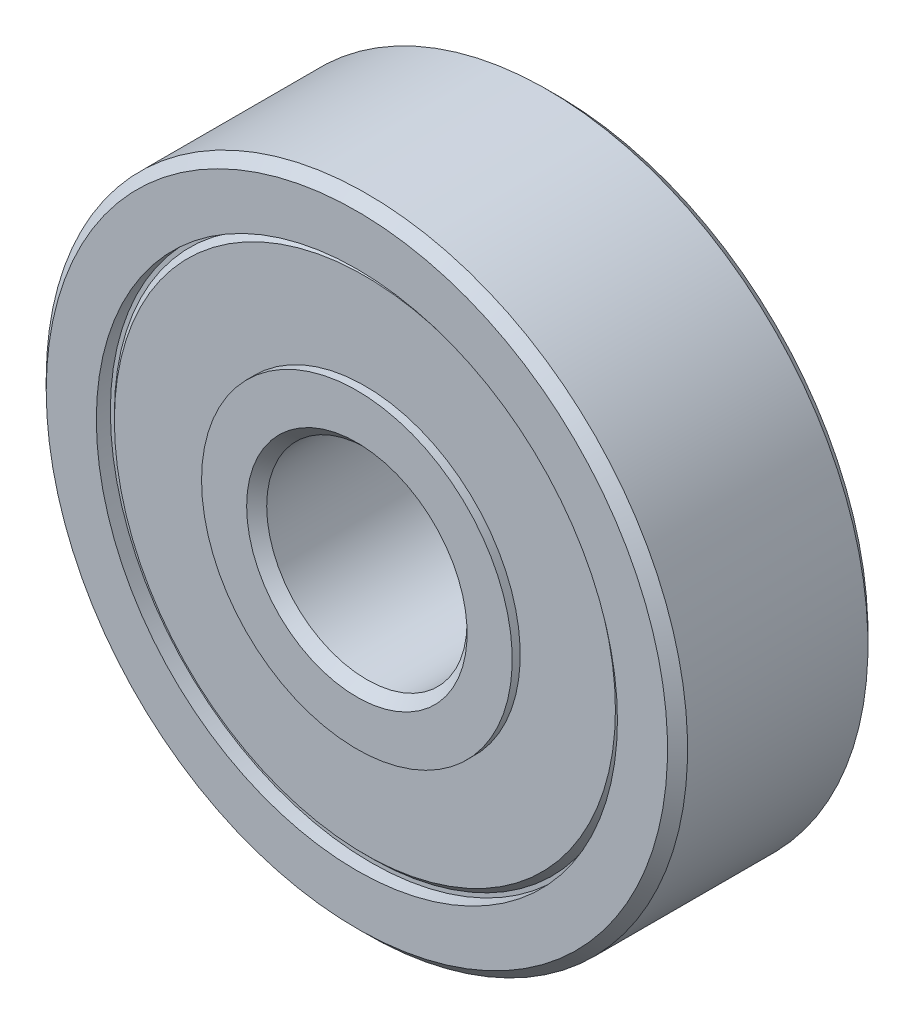
ISO-10303-21;
HEADER;
FILE_DESCRIPTION(('STEP AP214'),'2;1');
FILE_NAME('part.step','',(''),(''),'','','');
FILE_SCHEMA(('AUTOMOTIVE_DESIGN { 1 0 10303 214 1 1 1 1 }'));
ENDSEC;
DATA;
#1=APPLICATION_CONTEXT('core data for automotive mechanical design processes');
#2=APPLICATION_PROTOCOL_DEFINITION('international standard','automotive_design',2000,#1);
#3=PRODUCT_CONTEXT('',#1,'mechanical');
#4=PRODUCT('Part','Part','',(#3));
#5=PRODUCT_RELATED_PRODUCT_CATEGORY('part','',(#4));
#6=PRODUCT_DEFINITION_FORMATION('','',#4);
#7=PRODUCT_DEFINITION_CONTEXT('part definition',#1,'design');
#8=PRODUCT_DEFINITION('design','',#6,#7);
#9=PRODUCT_DEFINITION_SHAPE('','',#8);
#10=(LENGTH_UNIT() NAMED_UNIT(*) SI_UNIT(.MILLI.,.METRE.));
#11=(NAMED_UNIT(*) PLANE_ANGLE_UNIT() SI_UNIT($,.RADIAN.));
#12=(NAMED_UNIT(*) SI_UNIT($,.STERADIAN.) SOLID_ANGLE_UNIT());
#13=UNCERTAINTY_MEASURE_WITH_UNIT(LENGTH_MEASURE(1.E-05),#10,'distance_accuracy_value','');
#14=(GEOMETRIC_REPRESENTATION_CONTEXT(3) GLOBAL_UNCERTAINTY_ASSIGNED_CONTEXT((#13)) GLOBAL_UNIT_ASSIGNED_CONTEXT((#10,
#11,#12)) REPRESENTATION_CONTEXT('',''));
#15=CARTESIAN_POINT('',(0.,0.,0.));
#16=DIRECTION('',(0.,0.,1.));
#17=DIRECTION('',(1.,0.,0.));
#18=AXIS2_PLACEMENT_3D('',#15,#16,#17);
#19=CARTESIAN_POINT('',(0.,0.,-2.49999999999997));
#20=DIRECTION('',(0.,0.,-1.));
#21=DIRECTION('',(-1.,0.,0.));
#22=AXIS2_PLACEMENT_3D('',#19,#20,#21);
#23=CONICAL_SURFACE('',#22,2.74999999999991,0.785398163397768);
#24=CARTESIAN_POINT('',(0.,0.,-2.25000000000019));
#25=DIRECTION('',(0.,0.,-1.));
#26=DIRECTION('',(-1.,0.,0.));
#27=AXIS2_PLACEMENT_3D('',#24,#25,#26);
#28=CIRCLE('',#27,2.49999999999996);
#29=CARTESIAN_POINT('',(-2.49999999999996,0.,-2.25000000000019));
#30=VERTEX_POINT('',#29);
#31=EDGE_CURVE('E118',#30,#30,#28,.T.);
#32=ORIENTED_EDGE('',*,*,#31,.F.);
#33=EDGE_LOOP('',(#32));
#34=FACE_BOUND('',#33,.T.);
#35=CARTESIAN_POINT('',(0.,0.,-2.49999999999997));
#36=DIRECTION('',(0.,0.,-1.));
#37=DIRECTION('',(-1.,0.,0.));
#38=AXIS2_PLACEMENT_3D('',#35,#36,#37);
#39=CIRCLE('',#38,2.74999999999991);
#40=CARTESIAN_POINT('',(-2.74999999999991,0.,-2.49999999999997));
#41=VERTEX_POINT('',#40);
#42=EDGE_CURVE('E10',#41,#41,#39,.T.);
#43=ORIENTED_EDGE('',*,*,#42,.T.);
#44=EDGE_LOOP('',(#43));
#45=FACE_BOUND('',#44,.T.);
#46=ADVANCED_FACE('F34',(#34,#45),#23,.F.);
#47=CARTESIAN_POINT('',(2.74999999999991,0.,-2.49999999999997));
#48=DIRECTION('',(0.,0.,1.));
#49=DIRECTION('',(1.,0.,0.));
#50=AXIS2_PLACEMENT_3D('',#47,#48,#49);
#51=PLANE('',#50);
#52=ORIENTED_EDGE('',*,*,#42,.F.);
#53=EDGE_LOOP('',(#52));
#54=FACE_BOUND('',#53,.T.);
#55=CARTESIAN_POINT('',(0.,0.,-2.49999999999997));
#56=DIRECTION('',(0.,0.,-1.));
#57=DIRECTION('',(-1.,0.,0.));
#58=AXIS2_PLACEMENT_3D('',#55,#56,#57);
#59=CIRCLE('',#58,3.875);
#60=CARTESIAN_POINT('',(-3.875,0.,-2.49999999999997));
#61=VERTEX_POINT('',#60);
#62=EDGE_CURVE('E41',#61,#61,#59,.T.);
#63=ORIENTED_EDGE('',*,*,#62,.T.);
#64=EDGE_LOOP('',(#63));
#65=FACE_BOUND('',#64,.T.);
#66=ADVANCED_FACE('F125',(#54,#65),#51,.F.);
#67=CARTESIAN_POINT('',(0.,0.,-5.34568848414309));
#68=DIRECTION('',(0.,0.,-1.));
#69=DIRECTION('',(-1.,0.,0.));
#70=AXIS2_PLACEMENT_3D('',#67,#68,#69);
#71=CYLINDRICAL_SURFACE('',#70,3.875);
#72=ORIENTED_EDGE('',*,*,#62,.F.);
#73=EDGE_LOOP('',(#72));
#74=FACE_BOUND('',#73,.T.);
#75=CARTESIAN_POINT('',(0.,0.,-2.29999999999982));
#76=DIRECTION('',(0.,0.,-1.));
#77=DIRECTION('',(-1.,0.,0.));
#78=AXIS2_PLACEMENT_3D('',#75,#76,#77);
#79=CIRCLE('',#78,3.875);
#80=CARTESIAN_POINT('',(-3.875,0.,-2.29999999999982));
#81=VERTEX_POINT('',#80);
#82=EDGE_CURVE('E47',#81,#81,#79,.T.);
#83=ORIENTED_EDGE('',*,*,#82,.T.);
#84=EDGE_LOOP('',(#83));
#85=FACE_BOUND('',#84,.T.);
#86=ADVANCED_FACE('F129',(#74,#85),#71,.T.);
#87=CARTESIAN_POINT('',(3.875,0.,-2.29999999999982));
#88=DIRECTION('',(0.,0.,1.));
#89=DIRECTION('',(1.,0.,0.));
#90=AXIS2_PLACEMENT_3D('',#87,#88,#89);
#91=PLANE('',#90);
#92=ORIENTED_EDGE('',*,*,#82,.F.);
#93=EDGE_LOOP('',(#92));
#94=FACE_BOUND('',#93,.T.);
#95=CARTESIAN_POINT('',(0.,0.,-2.29999999999982));
#96=DIRECTION('',(0.,0.,-1.));
#97=DIRECTION('',(-1.,0.,0.));
#98=AXIS2_PLACEMENT_3D('',#95,#96,#97);
#99=CIRCLE('',#98,6.24999999999996);
#100=CARTESIAN_POINT('',(-6.24999999999996,0.,-2.29999999999982));
#101=VERTEX_POINT('',#100);
#102=EDGE_CURVE('E52',#101,#101,#99,.T.);
#103=ORIENTED_EDGE('',*,*,#102,.T.);
#104=EDGE_LOOP('',(#103));
#105=FACE_BOUND('',#104,.T.);
#106=ADVANCED_FACE('F134',(#94,#105),#91,.F.);
#107=CARTESIAN_POINT('',(0.,0.,-2.1500000000001));
#108=DIRECTION('',(0.,0.,1.));
#109=DIRECTION('',(1.,0.,0.));
#110=AXIS2_PLACEMENT_3D('',#107,#108,#109);
#111=CONICAL_SURFACE('',#110,6.3999999999999,0.785398163398171);
#112=ORIENTED_EDGE('',*,*,#102,.F.);
#113=EDGE_LOOP('',(#112));
#114=FACE_BOUND('',#113,.T.);
#115=CARTESIAN_POINT('',(0.,0.,-2.1500000000001));
#116=DIRECTION('',(0.,0.,-1.));
#117=DIRECTION('',(-1.,0.,0.));
#118=AXIS2_PLACEMENT_3D('',#115,#116,#117);
#119=CIRCLE('',#118,6.3999999999999);
#120=CARTESIAN_POINT('',(-6.3999999999999,0.,-2.1500000000001));
#121=VERTEX_POINT('',#120);
#122=EDGE_CURVE('E58',#121,#121,#119,.T.);
#123=ORIENTED_EDGE('',*,*,#122,.T.);
#124=EDGE_LOOP('',(#123));
#125=FACE_BOUND('',#124,.T.);
#126=ADVANCED_FACE('F140',(#114,#125),#111,.T.);
#127=CARTESIAN_POINT('',(6.3999999999999,0.,-2.15000000000005));
#128=DIRECTION('',(0.,0.,1.));
#129=DIRECTION('',(1.,0.,0.));
#130=AXIS2_PLACEMENT_3D('',#127,#128,#129);
#131=PLANE('',#130);
#132=ORIENTED_EDGE('',*,*,#122,.F.);
#133=EDGE_LOOP('',(#132));
#134=FACE_BOUND('',#133,.T.);
#135=CARTESIAN_POINT('',(0.,0.,-2.15));
#136=DIRECTION('',(0.,0.,-1.));
#137=DIRECTION('',(-1.,0.,0.));
#138=AXIS2_PLACEMENT_3D('',#135,#136,#137);
#139=CIRCLE('',#138,6.5);
#140=CARTESIAN_POINT('',(-6.5,0.,-2.15));
#141=VERTEX_POINT('',#140);
#142=EDGE_CURVE('E62',#141,#141,#139,.T.);
#143=ORIENTED_EDGE('',*,*,#142,.T.);
#144=EDGE_LOOP('',(#143));
#145=FACE_BOUND('',#144,.T.);
#146=ADVANCED_FACE('F144',(#134,#145),#131,.F.);
#147=CARTESIAN_POINT('',(0.,0.,-5.34568848414309));
#148=DIRECTION('',(0.,0.,-1.));
#149=DIRECTION('',(-1.,0.,0.));
#150=AXIS2_PLACEMENT_3D('',#147,#148,#149);
#151=CYLINDRICAL_SURFACE('',#150,6.5);
#152=ORIENTED_EDGE('',*,*,#142,.F.);
#153=EDGE_LOOP('',(#152));
#154=FACE_BOUND('',#153,.T.);
#155=CARTESIAN_POINT('',(0.,0.,-2.5));
#156=DIRECTION('',(0.,0.,-1.));
#157=DIRECTION('',(-1.,0.,0.));
#158=AXIS2_PLACEMENT_3D('',#155,#156,#157);
#159=CIRCLE('',#158,6.5);
#160=CARTESIAN_POINT('',(-6.5,0.,-2.5));
#161=VERTEX_POINT('',#160);
#162=EDGE_CURVE('E66',#161,#161,#159,.T.);
#163=ORIENTED_EDGE('',*,*,#162,.T.);
#164=EDGE_LOOP('',(#163));
#165=FACE_BOUND('',#164,.T.);
#166=ADVANCED_FACE('F148',(#154,#165),#151,.F.);
#167=CARTESIAN_POINT('',(6.5,0.,-2.49999999999997));
#168=DIRECTION('',(0.,0.,1.));
#169=DIRECTION('',(1.,0.,0.));
#170=AXIS2_PLACEMENT_3D('',#167,#168,#169);
#171=PLANE('',#170);
#172=ORIENTED_EDGE('',*,*,#162,.F.);
#173=EDGE_LOOP('',(#172));
#174=FACE_BOUND('',#173,.T.);
#175=CARTESIAN_POINT('',(0.,0.,-2.49999999999995));
#176=DIRECTION('',(0.,0.,-1.));
#177=DIRECTION('',(-1.,0.,0.));
#178=AXIS2_PLACEMENT_3D('',#175,#176,#177);
#179=CIRCLE('',#178,7.75000000000005);
#180=CARTESIAN_POINT('',(-7.75000000000005,0.,-2.49999999999995));
#181=VERTEX_POINT('',#180);
#182=EDGE_CURVE('E70',#181,#181,#179,.T.);
#183=ORIENTED_EDGE('',*,*,#182,.T.);
#184=EDGE_LOOP('',(#183));
#185=FACE_BOUND('',#184,.T.);
#186=ADVANCED_FACE('F152',(#174,#185),#171,.F.);
#187=CARTESIAN_POINT('',(0.,0.,-2.25000000000009));
#188=DIRECTION('',(0.,0.,1.));
#189=DIRECTION('',(1.,0.,0.));
#190=AXIS2_PLACEMENT_3D('',#187,#188,#189);
#191=CONICAL_SURFACE('',#190,8.,0.785398163397619);
#192=ORIENTED_EDGE('',*,*,#182,.F.);
#193=EDGE_LOOP('',(#192));
#194=FACE_BOUND('',#193,.T.);
#195=CARTESIAN_POINT('',(0.,0.,-2.25000000000009));
#196=DIRECTION('',(0.,0.,-1.));
#197=DIRECTION('',(-1.,0.,0.));
#198=AXIS2_PLACEMENT_3D('',#195,#196,#197);
#199=CIRCLE('',#198,8.);
#200=CARTESIAN_POINT('',(-8.,0.,-2.25000000000009));
#201=VERTEX_POINT('',#200);
#202=EDGE_CURVE('E74',#201,#201,#199,.T.);
#203=ORIENTED_EDGE('',*,*,#202,.T.);
#204=EDGE_LOOP('',(#203));
#205=FACE_BOUND('',#204,.T.);
#206=ADVANCED_FACE('F156',(#194,#205),#191,.T.);
#207=CARTESIAN_POINT('',(0.,0.,-5.34568848414309));
#208=DIRECTION('',(0.,0.,-1.));
#209=DIRECTION('',(-1.,0.,0.));
#210=AXIS2_PLACEMENT_3D('',#207,#208,#209);
#211=CYLINDRICAL_SURFACE('',#210,8.);
#212=ORIENTED_EDGE('',*,*,#202,.F.);
#213=EDGE_LOOP('',(#212));
#214=FACE_BOUND('',#213,.T.);
#215=CARTESIAN_POINT('',(0.,0.,2.25000000000019));
#216=DIRECTION('',(0.,0.,-1.));
#217=DIRECTION('',(-1.,0.,0.));
#218=AXIS2_PLACEMENT_3D('',#215,#216,#217);
#219=CIRCLE('',#218,8.);
#220=CARTESIAN_POINT('',(-8.,0.,2.25000000000019));
#221=VERTEX_POINT('',#220);
#222=EDGE_CURVE('E78',#221,#221,#219,.T.);
#223=ORIENTED_EDGE('',*,*,#222,.T.);
#224=EDGE_LOOP('',(#223));
#225=FACE_BOUND('',#224,.T.);
#226=ADVANCED_FACE('F160',(#214,#225),#211,.T.);
#227=CARTESIAN_POINT('',(0.,0.,2.49999999999995));
#228=DIRECTION('',(0.,0.,-1.));
#229=DIRECTION('',(-1.,0.,0.));
#230=AXIS2_PLACEMENT_3D('',#227,#228,#229);
#231=CONICAL_SURFACE('',#230,7.75000000000005,0.785398163397823);
#232=ORIENTED_EDGE('',*,*,#222,.F.);
#233=EDGE_LOOP('',(#232));
#234=FACE_BOUND('',#233,.T.);
#235=CARTESIAN_POINT('',(0.,0.,2.49999999999995));
#236=DIRECTION('',(0.,0.,-1.));
#237=DIRECTION('',(-1.,0.,0.));
#238=AXIS2_PLACEMENT_3D('',#235,#236,#237);
#239=CIRCLE('',#238,7.75000000000005);
#240=CARTESIAN_POINT('',(-7.75000000000005,0.,2.49999999999995));
#241=VERTEX_POINT('',#240);
#242=EDGE_CURVE('E82',#241,#241,#239,.T.);
#243=ORIENTED_EDGE('',*,*,#242,.T.);
#244=EDGE_LOOP('',(#243));
#245=FACE_BOUND('',#244,.T.);
#246=ADVANCED_FACE('F164',(#234,#245),#231,.T.);
#247=CARTESIAN_POINT('',(6.5,0.,2.49999999999997));
#248=DIRECTION('',(0.,0.,-1.));
#249=DIRECTION('',(-1.,0.,0.));
#250=AXIS2_PLACEMENT_3D('',#247,#248,#249);
#251=PLANE('',#250);
#252=ORIENTED_EDGE('',*,*,#242,.F.);
#253=EDGE_LOOP('',(#252));
#254=FACE_BOUND('',#253,.T.);
#255=CARTESIAN_POINT('',(0.,0.,2.5));
#256=DIRECTION('',(0.,0.,-1.));
#257=DIRECTION('',(-1.,0.,0.));
#258=AXIS2_PLACEMENT_3D('',#255,#256,#257);
#259=CIRCLE('',#258,6.5);
#260=CARTESIAN_POINT('',(-6.5,0.,2.5));
#261=VERTEX_POINT('',#260);
#262=EDGE_CURVE('E86',#261,#261,#259,.T.);
#263=ORIENTED_EDGE('',*,*,#262,.T.);
#264=EDGE_LOOP('',(#263));
#265=FACE_BOUND('',#264,.T.);
#266=ADVANCED_FACE('F168',(#254,#265),#251,.F.);
#267=CARTESIAN_POINT('',(0.,0.,-5.34568848414309));
#268=DIRECTION('',(0.,0.,-1.));
#269=DIRECTION('',(-1.,0.,0.));
#270=AXIS2_PLACEMENT_3D('',#267,#268,#269);
#271=CYLINDRICAL_SURFACE('',#270,6.5);
#272=ORIENTED_EDGE('',*,*,#262,.F.);
#273=EDGE_LOOP('',(#272));
#274=FACE_BOUND('',#273,.T.);
#275=CARTESIAN_POINT('',(0.,0.,2.15));
#276=DIRECTION('',(0.,0.,-1.));
#277=DIRECTION('',(-1.,0.,0.));
#278=AXIS2_PLACEMENT_3D('',#275,#276,#277);
#279=CIRCLE('',#278,6.5);
#280=CARTESIAN_POINT('',(-6.5,0.,2.15));
#281=VERTEX_POINT('',#280);
#282=EDGE_CURVE('E90',#281,#281,#279,.T.);
#283=ORIENTED_EDGE('',*,*,#282,.T.);
#284=EDGE_LOOP('',(#283));
#285=FACE_BOUND('',#284,.T.);
#286=ADVANCED_FACE('F172',(#274,#285),#271,.F.);
#287=CARTESIAN_POINT('',(6.39999999999988,0.,2.15000000000003));
#288=DIRECTION('',(0.,0.,-1.));
#289=DIRECTION('',(-1.,0.,0.));
#290=AXIS2_PLACEMENT_3D('',#287,#288,#289);
#291=PLANE('',#290);
#292=ORIENTED_EDGE('',*,*,#282,.F.);
#293=EDGE_LOOP('',(#292));
#294=FACE_BOUND('',#293,.T.);
#295=CARTESIAN_POINT('',(0.,0.,2.15000000000006));
#296=DIRECTION('',(0.,0.,-1.));
#297=DIRECTION('',(-1.,0.,0.));
#298=AXIS2_PLACEMENT_3D('',#295,#296,#297);
#299=CIRCLE('',#298,6.39999999999988);
#300=CARTESIAN_POINT('',(-6.39999999999988,0.,2.15000000000006));
#301=VERTEX_POINT('',#300);
#302=EDGE_CURVE('E94',#301,#301,#299,.T.);
#303=ORIENTED_EDGE('',*,*,#302,.T.);
#304=EDGE_LOOP('',(#303));
#305=FACE_BOUND('',#304,.T.);
#306=ADVANCED_FACE('F176',(#294,#305),#291,.F.);
#307=CARTESIAN_POINT('',(0.,0.,2.29999999999982));
#308=DIRECTION('',(0.,0.,-1.));
#309=DIRECTION('',(-1.,0.,0.));
#310=AXIS2_PLACEMENT_3D('',#307,#308,#309);
#311=CONICAL_SURFACE('',#310,6.24999999999996,0.785398163397966);
#312=ORIENTED_EDGE('',*,*,#302,.F.);
#313=EDGE_LOOP('',(#312));
#314=FACE_BOUND('',#313,.T.);
#315=CARTESIAN_POINT('',(0.,0.,2.29999999999982));
#316=DIRECTION('',(0.,0.,-1.));
#317=DIRECTION('',(-1.,0.,0.));
#318=AXIS2_PLACEMENT_3D('',#315,#316,#317);
#319=CIRCLE('',#318,6.24999999999996);
#320=CARTESIAN_POINT('',(-6.24999999999996,0.,2.29999999999982));
#321=VERTEX_POINT('',#320);
#322=EDGE_CURVE('E98',#321,#321,#319,.T.);
#323=ORIENTED_EDGE('',*,*,#322,.T.);
#324=EDGE_LOOP('',(#323));
#325=FACE_BOUND('',#324,.T.);
#326=ADVANCED_FACE('F180',(#314,#325),#311,.T.);
#327=CARTESIAN_POINT('',(3.875,0.,2.29999999999982));
#328=DIRECTION('',(0.,0.,-1.));
#329=DIRECTION('',(-1.,0.,0.));
#330=AXIS2_PLACEMENT_3D('',#327,#328,#329);
#331=PLANE('',#330);
#332=ORIENTED_EDGE('',*,*,#322,.F.);
#333=EDGE_LOOP('',(#332));
#334=FACE_BOUND('',#333,.T.);
#335=CARTESIAN_POINT('',(0.,0.,2.29999999999982));
#336=DIRECTION('',(0.,0.,-1.));
#337=DIRECTION('',(-1.,0.,0.));
#338=AXIS2_PLACEMENT_3D('',#335,#336,#337);
#339=CIRCLE('',#338,3.875);
#340=CARTESIAN_POINT('',(-3.875,0.,2.29999999999982));
#341=VERTEX_POINT('',#340);
#342=EDGE_CURVE('E102',#341,#341,#339,.T.);
#343=ORIENTED_EDGE('',*,*,#342,.T.);
#344=EDGE_LOOP('',(#343));
#345=FACE_BOUND('',#344,.T.);
#346=ADVANCED_FACE('F184',(#334,#345),#331,.F.);
#347=CARTESIAN_POINT('',(0.,0.,-5.34568848414309));
#348=DIRECTION('',(0.,0.,-1.));
#349=DIRECTION('',(-1.,0.,0.));
#350=AXIS2_PLACEMENT_3D('',#347,#348,#349);
#351=CYLINDRICAL_SURFACE('',#350,3.875);
#352=ORIENTED_EDGE('',*,*,#342,.F.);
#353=EDGE_LOOP('',(#352));
#354=FACE_BOUND('',#353,.T.);
#355=CARTESIAN_POINT('',(0.,0.,2.49999999999997));
#356=DIRECTION('',(0.,0.,-1.));
#357=DIRECTION('',(-1.,0.,0.));
#358=AXIS2_PLACEMENT_3D('',#355,#356,#357);
#359=CIRCLE('',#358,3.875);
#360=CARTESIAN_POINT('',(-3.875,0.,2.49999999999997));
#361=VERTEX_POINT('',#360);
#362=EDGE_CURVE('E106',#361,#361,#359,.T.);
#363=ORIENTED_EDGE('',*,*,#362,.T.);
#364=EDGE_LOOP('',(#363));
#365=FACE_BOUND('',#364,.T.);
#366=ADVANCED_FACE('F188',(#354,#365),#351,.T.);
#367=CARTESIAN_POINT('',(2.74999999999991,0.,2.49999999999997));
#368=DIRECTION('',(0.,0.,-1.));
#369=DIRECTION('',(-1.,0.,0.));
#370=AXIS2_PLACEMENT_3D('',#367,#368,#369);
#371=PLANE('',#370);
#372=ORIENTED_EDGE('',*,*,#362,.F.);
#373=EDGE_LOOP('',(#372));
#374=FACE_BOUND('',#373,.T.);
#375=CARTESIAN_POINT('',(0.,0.,2.49999999999997));
#376=DIRECTION('',(0.,0.,-1.));
#377=DIRECTION('',(-1.,0.,0.));
#378=AXIS2_PLACEMENT_3D('',#375,#376,#377);
#379=CIRCLE('',#378,2.74999999999991);
#380=CARTESIAN_POINT('',(-2.74999999999991,0.,2.49999999999997));
#381=VERTEX_POINT('',#380);
#382=EDGE_CURVE('E110',#381,#381,#379,.T.);
#383=ORIENTED_EDGE('',*,*,#382,.T.);
#384=EDGE_LOOP('',(#383));
#385=FACE_BOUND('',#384,.T.);
#386=ADVANCED_FACE('F192',(#374,#385),#371,.F.);
#387=CARTESIAN_POINT('',(0.,0.,2.25000000000019));
#388=DIRECTION('',(0.,0.,1.));
#389=DIRECTION('',(1.,0.,0.));
#390=AXIS2_PLACEMENT_3D('',#387,#388,#389);
#391=CONICAL_SURFACE('',#390,2.49999999999996,0.785398163397769);
#392=ORIENTED_EDGE('',*,*,#382,.F.);
#393=EDGE_LOOP('',(#392));
#394=FACE_BOUND('',#393,.T.);
#395=CARTESIAN_POINT('',(0.,0.,2.25000000000019));
#396=DIRECTION('',(0.,0.,-1.));
#397=DIRECTION('',(-1.,0.,0.));
#398=AXIS2_PLACEMENT_3D('',#395,#396,#397);
#399=CIRCLE('',#398,2.49999999999996);
#400=CARTESIAN_POINT('',(-2.49999999999996,0.,2.25000000000019));
#401=VERTEX_POINT('',#400);
#402=EDGE_CURVE('E114',#401,#401,#399,.T.);
#403=ORIENTED_EDGE('',*,*,#402,.T.);
#404=EDGE_LOOP('',(#403));
#405=FACE_BOUND('',#404,.T.);
#406=ADVANCED_FACE('F196',(#394,#405),#391,.F.);
#407=CARTESIAN_POINT('',(0.,0.,-5.34568848414309));
#408=DIRECTION('',(0.,0.,-1.));
#409=DIRECTION('',(-1.,0.,0.));
#410=AXIS2_PLACEMENT_3D('',#407,#408,#409);
#411=CYLINDRICAL_SURFACE('',#410,2.49999999999996);
#412=ORIENTED_EDGE('',*,*,#402,.F.);
#413=EDGE_LOOP('',(#412));
#414=FACE_BOUND('',#413,.T.);
#415=ORIENTED_EDGE('',*,*,#31,.T.);
#416=EDGE_LOOP('',(#415));
#417=FACE_BOUND('',#416,.T.);
#418=ADVANCED_FACE('F122',(#414,#417),#411,.F.);
#419=CLOSED_SHELL('',(#46,#66,#86,#106,#126,#146,#166,#186,#206,#226,#246,#266,#286,#306,#326,
#346,#366,#386,#406,#418));
#420=MANIFOLD_SOLID_BREP('B2',#419);
#421=ADVANCED_BREP_SHAPE_REPRESENTATION('',(#18,#420),#14);
#422=SHAPE_DEFINITION_REPRESENTATION(#9,#421);
ENDSEC;
END-ISO-10303-21;
